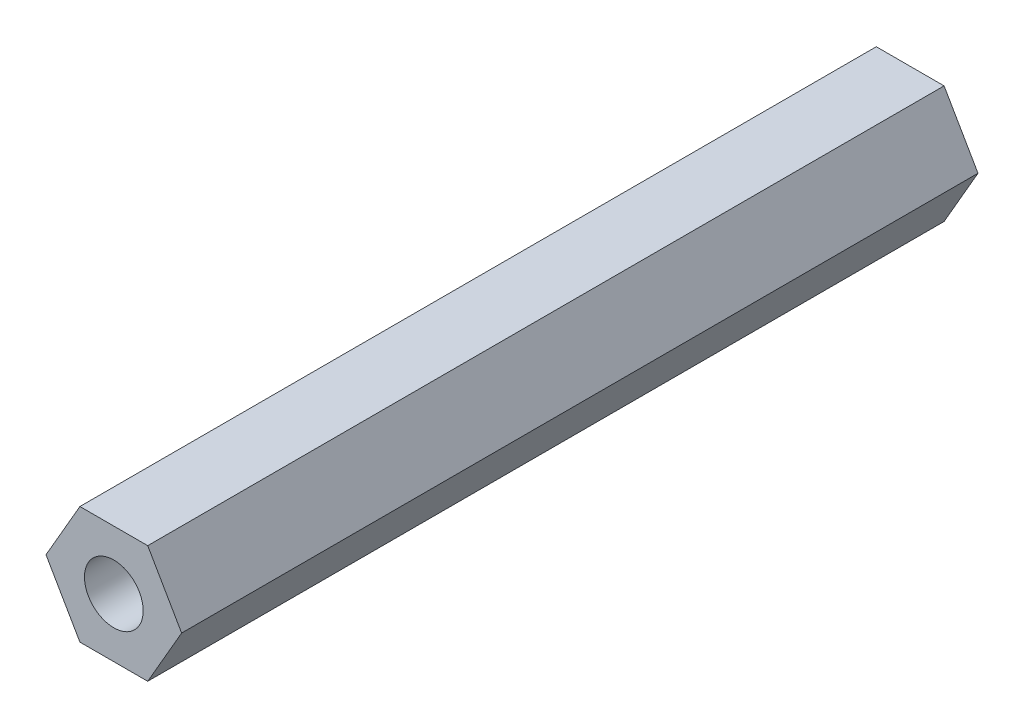
ISO-10303-21;
HEADER;
FILE_DESCRIPTION(('STEP AP214'),'2;1');
FILE_NAME('part.step','',(''),(''),'','','');
FILE_SCHEMA(('AUTOMOTIVE_DESIGN { 1 0 10303 214 1 1 1 1 }'));
ENDSEC;
DATA;
#1=APPLICATION_CONTEXT('core data for automotive mechanical design processes');
#2=APPLICATION_PROTOCOL_DEFINITION('international standard','automotive_design',2000,#1);
#3=PRODUCT_CONTEXT('',#1,'mechanical');
#4=PRODUCT('Part','Part','',(#3));
#5=PRODUCT_RELATED_PRODUCT_CATEGORY('part','',(#4));
#6=PRODUCT_DEFINITION_FORMATION('','',#4);
#7=PRODUCT_DEFINITION_CONTEXT('part definition',#1,'design');
#8=PRODUCT_DEFINITION('design','',#6,#7);
#9=PRODUCT_DEFINITION_SHAPE('','',#8);
#10=(LENGTH_UNIT() NAMED_UNIT(*) SI_UNIT(.MILLI.,.METRE.));
#11=(NAMED_UNIT(*) PLANE_ANGLE_UNIT() SI_UNIT($,.RADIAN.));
#12=(NAMED_UNIT(*) SI_UNIT($,.STERADIAN.) SOLID_ANGLE_UNIT());
#13=UNCERTAINTY_MEASURE_WITH_UNIT(LENGTH_MEASURE(1.E-05),#10,'distance_accuracy_value','');
#14=(GEOMETRIC_REPRESENTATION_CONTEXT(3) GLOBAL_UNCERTAINTY_ASSIGNED_CONTEXT((#13)) GLOBAL_UNIT_ASSIGNED_CONTEXT((#10,
#11,#12)) REPRESENTATION_CONTEXT('',''));
#15=CARTESIAN_POINT('',(0.,0.,0.));
#16=DIRECTION('',(0.,0.,1.));
#17=DIRECTION('',(1.,0.,0.));
#18=AXIS2_PLACEMENT_3D('',#15,#16,#17);
#19=CARTESIAN_POINT('',(0.,0.,43.053));
#20=DIRECTION('',(0.,0.,1.));
#21=DIRECTION('',(1.,0.,0.));
#22=AXIS2_PLACEMENT_3D('',#19,#20,#21);
#23=PLANE('',#22);
#24=DIRECTION('',(-0.5,0.866025403784439,0.));
#25=VECTOR('',#24,1.);
#26=CARTESIAN_POINT('',(7.33234841870825,0.,43.053));
#27=LINE('',#26,#25);
#28=CARTESIAN_POINT('',(7.33234841870825,0.,43.053));
#29=VERTEX_POINT('',#28);
#30=CARTESIAN_POINT('',(3.66617420935413,6.35,43.053));
#31=VERTEX_POINT('',#30);
#32=EDGE_CURVE('E146',#29,#31,#27,.T.);
#33=ORIENTED_EDGE('',*,*,#32,.T.);
#34=DIRECTION('',(-1.,0.,0.));
#35=VECTOR('',#34,1.);
#36=CARTESIAN_POINT('',(3.66617420935413,6.35,43.053));
#37=LINE('',#36,#35);
#38=CARTESIAN_POINT('',(-3.66617420935412,6.35,43.053));
#39=VERTEX_POINT('',#38);
#40=EDGE_CURVE('E94',#31,#39,#37,.T.);
#41=ORIENTED_EDGE('',*,*,#40,.T.);
#42=DIRECTION('',(-0.5,-0.866025403784438,0.));
#43=VECTOR('',#42,1.);
#44=CARTESIAN_POINT('',(-3.66617420935412,6.35,43.053));
#45=LINE('',#44,#43);
#46=CARTESIAN_POINT('',(-7.33234841870825,0.,43.053));
#47=VERTEX_POINT('',#46);
#48=EDGE_CURVE('E107',#39,#47,#45,.T.);
#49=ORIENTED_EDGE('',*,*,#48,.T.);
#50=DIRECTION('',(0.5,-0.866025403784439,0.));
#51=VECTOR('',#50,1.);
#52=CARTESIAN_POINT('',(-7.33234841870825,0.,43.053));
#53=LINE('',#52,#51);
#54=CARTESIAN_POINT('',(-3.66617420935413,-6.35,43.053));
#55=VERTEX_POINT('',#54);
#56=EDGE_CURVE('E101',#47,#55,#53,.T.);
#57=ORIENTED_EDGE('',*,*,#56,.T.);
#58=DIRECTION('',(1.,0.,0.));
#59=VECTOR('',#58,1.);
#60=CARTESIAN_POINT('',(-3.66617420935413,-6.35,43.053));
#61=LINE('',#60,#59);
#62=CARTESIAN_POINT('',(3.66617420935412,-6.35,43.053));
#63=VERTEX_POINT('',#62);
#64=EDGE_CURVE('E105',#55,#63,#61,.T.);
#65=ORIENTED_EDGE('',*,*,#64,.T.);
#66=DIRECTION('',(0.5,0.866025403784438,0.));
#67=VECTOR('',#66,1.);
#68=CARTESIAN_POINT('',(3.66617420935412,-6.35,43.053));
#69=LINE('',#68,#67);
#70=EDGE_CURVE('E57',#63,#29,#69,.T.);
#71=ORIENTED_EDGE('',*,*,#70,.T.);
#72=EDGE_LOOP('',(#33,#41,#49,#57,#65,#71));
#73=FACE_BOUND('',#72,.T.);
#74=CARTESIAN_POINT('',(0.,0.,43.053));
#75=DIRECTION('',(0.,0.,1.));
#76=DIRECTION('',(1.,0.,0.));
#77=AXIS2_PLACEMENT_3D('',#74,#75,#76);
#78=CIRCLE('',#77,3.175);
#79=CARTESIAN_POINT('',(3.175,0.,43.053));
#80=VERTEX_POINT('',#79);
#81=EDGE_CURVE('E134',#80,#80,#78,.T.);
#82=ORIENTED_EDGE('',*,*,#81,.F.);
#83=EDGE_LOOP('',(#82));
#84=FACE_BOUND('',#83,.T.);
#85=ADVANCED_FACE('F39',(#73,#84),#23,.T.);
#86=CARTESIAN_POINT('',(0.,0.,-43.053));
#87=DIRECTION('',(0.,0.,1.));
#88=DIRECTION('',(1.,0.,0.));
#89=AXIS2_PLACEMENT_3D('',#86,#87,#88);
#90=PLANE('',#89);
#91=DIRECTION('',(-0.5,0.866025403784439,0.));
#92=VECTOR('',#91,1.);
#93=CARTESIAN_POINT('',(7.33234841870825,0.,-43.053));
#94=LINE('',#93,#92);
#95=CARTESIAN_POINT('',(7.33234841870825,0.,-43.053));
#96=VERTEX_POINT('',#95);
#97=CARTESIAN_POINT('',(3.66617420935413,6.35,-43.053));
#98=VERTEX_POINT('',#97);
#99=EDGE_CURVE('E129',#96,#98,#94,.T.);
#100=ORIENTED_EDGE('',*,*,#99,.F.);
#101=DIRECTION('',(0.5,0.866025403784438,0.));
#102=VECTOR('',#101,1.);
#103=CARTESIAN_POINT('',(3.66617420935412,-6.35,-43.053));
#104=LINE('',#103,#102);
#105=CARTESIAN_POINT('',(3.66617420935412,-6.35,-43.053));
#106=VERTEX_POINT('',#105);
#107=EDGE_CURVE('E86',#106,#96,#104,.T.);
#108=ORIENTED_EDGE('',*,*,#107,.F.);
#109=DIRECTION('',(1.,0.,0.));
#110=VECTOR('',#109,1.);
#111=CARTESIAN_POINT('',(-3.66617420935413,-6.35,-43.053));
#112=LINE('',#111,#110);
#113=CARTESIAN_POINT('',(-3.66617420935413,-6.35,-43.053));
#114=VERTEX_POINT('',#113);
#115=EDGE_CURVE('E80',#114,#106,#112,.T.);
#116=ORIENTED_EDGE('',*,*,#115,.F.);
#117=DIRECTION('',(0.5,-0.866025403784439,0.));
#118=VECTOR('',#117,1.);
#119=CARTESIAN_POINT('',(-7.33234841870825,0.,-43.053));
#120=LINE('',#119,#118);
#121=CARTESIAN_POINT('',(-7.33234841870825,0.,-43.053));
#122=VERTEX_POINT('',#121);
#123=EDGE_CURVE('E116',#122,#114,#120,.T.);
#124=ORIENTED_EDGE('',*,*,#123,.F.);
#125=DIRECTION('',(-0.5,-0.866025403784438,0.));
#126=VECTOR('',#125,1.);
#127=CARTESIAN_POINT('',(-3.66617420935412,6.35,-43.053));
#128=LINE('',#127,#126);
#129=CARTESIAN_POINT('',(-3.66617420935412,6.35,-43.053));
#130=VERTEX_POINT('',#129);
#131=EDGE_CURVE('E137',#130,#122,#128,.T.);
#132=ORIENTED_EDGE('',*,*,#131,.F.);
#133=DIRECTION('',(-1.,0.,0.));
#134=VECTOR('',#133,1.);
#135=CARTESIAN_POINT('',(3.66617420935413,6.35,-43.053));
#136=LINE('',#135,#134);
#137=EDGE_CURVE('E133',#98,#130,#136,.T.);
#138=ORIENTED_EDGE('',*,*,#137,.F.);
#139=EDGE_LOOP('',(#100,#108,#116,#124,#132,#138));
#140=FACE_BOUND('',#139,.T.);
#141=CARTESIAN_POINT('',(0.,0.,-43.053));
#142=DIRECTION('',(0.,0.,1.));
#143=DIRECTION('',(1.,0.,0.));
#144=AXIS2_PLACEMENT_3D('',#141,#142,#143);
#145=CIRCLE('',#144,3.175);
#146=CARTESIAN_POINT('',(3.175,0.,-43.053));
#147=VERTEX_POINT('',#146);
#148=EDGE_CURVE('E243',#147,#147,#145,.T.);
#149=ORIENTED_EDGE('',*,*,#148,.T.);
#150=EDGE_LOOP('',(#149));
#151=FACE_BOUND('',#150,.T.);
#152=ADVANCED_FACE('F159',(#140,#151),#90,.F.);
#153=CARTESIAN_POINT('',(7.33234841870825,0.,43.053));
#154=DIRECTION('',(-0.866025403784439,-0.5,0.));
#155=DIRECTION('',(0.5,-0.866025403784439,0.));
#156=AXIS2_PLACEMENT_3D('',#153,#154,#155);
#157=PLANE('',#156);
#158=ORIENTED_EDGE('',*,*,#99,.T.);
#159=DIRECTION('',(0.,0.,-1.));
#160=VECTOR('',#159,1.);
#161=CARTESIAN_POINT('',(3.66617420935413,6.35,43.053));
#162=LINE('',#161,#160);
#163=EDGE_CURVE('E11',#31,#98,#162,.T.);
#164=ORIENTED_EDGE('',*,*,#163,.F.);
#165=ORIENTED_EDGE('',*,*,#32,.F.);
#166=DIRECTION('',(0.,0.,-1.));
#167=VECTOR('',#166,1.);
#168=CARTESIAN_POINT('',(7.33234841870825,0.,43.053));
#169=LINE('',#168,#167);
#170=EDGE_CURVE('E125',#29,#96,#169,.T.);
#171=ORIENTED_EDGE('',*,*,#170,.T.);
#172=EDGE_LOOP('',(#158,#164,#165,#171));
#173=FACE_BOUND('',#172,.T.);
#174=ADVANCED_FACE('F41',(#173),#157,.F.);
#175=CARTESIAN_POINT('',(3.66617420935413,6.35,43.053));
#176=DIRECTION('',(0.,-1.,0.));
#177=DIRECTION('',(1.,0.,0.));
#178=AXIS2_PLACEMENT_3D('',#175,#176,#177);
#179=PLANE('',#178);
#180=ORIENTED_EDGE('',*,*,#137,.T.);
#181=DIRECTION('',(0.,0.,-1.));
#182=VECTOR('',#181,1.);
#183=CARTESIAN_POINT('',(-3.66617420935412,6.35,43.053));
#184=LINE('',#183,#182);
#185=EDGE_CURVE('E49',#39,#130,#184,.T.);
#186=ORIENTED_EDGE('',*,*,#185,.F.);
#187=ORIENTED_EDGE('',*,*,#40,.F.);
#188=ORIENTED_EDGE('',*,*,#163,.T.);
#189=EDGE_LOOP('',(#180,#186,#187,#188));
#190=FACE_BOUND('',#189,.T.);
#191=ADVANCED_FACE('F184',(#190),#179,.F.);
#192=CARTESIAN_POINT('',(-3.66617420935412,6.35,43.053));
#193=DIRECTION('',(0.866025403784439,-0.5,0.));
#194=DIRECTION('',(0.5,0.866025403784439,0.));
#195=AXIS2_PLACEMENT_3D('',#192,#193,#194);
#196=PLANE('',#195);
#197=ORIENTED_EDGE('',*,*,#131,.T.);
#198=DIRECTION('',(0.,0.,-1.));
#199=VECTOR('',#198,1.);
#200=CARTESIAN_POINT('',(-7.33234841870825,0.,43.053));
#201=LINE('',#200,#199);
#202=EDGE_CURVE('E118',#47,#122,#201,.T.);
#203=ORIENTED_EDGE('',*,*,#202,.F.);
#204=ORIENTED_EDGE('',*,*,#48,.F.);
#205=ORIENTED_EDGE('',*,*,#185,.T.);
#206=EDGE_LOOP('',(#197,#203,#204,#205));
#207=FACE_BOUND('',#206,.T.);
#208=ADVANCED_FACE('F156',(#207),#196,.F.);
#209=CARTESIAN_POINT('',(-7.33234841870825,0.,43.053));
#210=DIRECTION('',(0.866025403784439,0.5,0.));
#211=DIRECTION('',(-0.5,0.866025403784439,0.));
#212=AXIS2_PLACEMENT_3D('',#209,#210,#211);
#213=PLANE('',#212);
#214=ORIENTED_EDGE('',*,*,#123,.T.);
#215=DIRECTION('',(0.,0.,-1.));
#216=VECTOR('',#215,1.);
#217=CARTESIAN_POINT('',(-3.66617420935413,-6.35,43.053));
#218=LINE('',#217,#216);
#219=EDGE_CURVE('E113',#55,#114,#218,.T.);
#220=ORIENTED_EDGE('',*,*,#219,.F.);
#221=ORIENTED_EDGE('',*,*,#56,.F.);
#222=ORIENTED_EDGE('',*,*,#202,.T.);
#223=EDGE_LOOP('',(#214,#220,#221,#222));
#224=FACE_BOUND('',#223,.T.);
#225=ADVANCED_FACE('F114',(#224),#213,.F.);
#226=CARTESIAN_POINT('',(-3.66617420935413,-6.35,43.053));
#227=DIRECTION('',(0.,1.,0.));
#228=DIRECTION('',(-1.,0.,0.));
#229=AXIS2_PLACEMENT_3D('',#226,#227,#228);
#230=PLANE('',#229);
#231=ORIENTED_EDGE('',*,*,#115,.T.);
#232=DIRECTION('',(0.,0.,-1.));
#233=VECTOR('',#232,1.);
#234=CARTESIAN_POINT('',(3.66617420935412,-6.35,43.053));
#235=LINE('',#234,#233);
#236=EDGE_CURVE('E119',#63,#106,#235,.T.);
#237=ORIENTED_EDGE('',*,*,#236,.F.);
#238=ORIENTED_EDGE('',*,*,#64,.F.);
#239=ORIENTED_EDGE('',*,*,#219,.T.);
#240=EDGE_LOOP('',(#231,#237,#238,#239));
#241=FACE_BOUND('',#240,.T.);
#242=ADVANCED_FACE('F121',(#241),#230,.F.);
#243=CARTESIAN_POINT('',(3.66617420935412,-6.35,43.053));
#244=DIRECTION('',(-0.866025403784438,0.5,0.));
#245=DIRECTION('',(-0.5,-0.866025403784438,0.));
#246=AXIS2_PLACEMENT_3D('',#243,#244,#245);
#247=PLANE('',#246);
#248=ORIENTED_EDGE('',*,*,#107,.T.);
#249=ORIENTED_EDGE('',*,*,#170,.F.);
#250=ORIENTED_EDGE('',*,*,#70,.F.);
#251=ORIENTED_EDGE('',*,*,#236,.T.);
#252=EDGE_LOOP('',(#248,#249,#250,#251));
#253=FACE_BOUND('',#252,.T.);
#254=ADVANCED_FACE('F164',(#253),#247,.F.);
#255=CARTESIAN_POINT('',(0.,0.,43.053));
#256=DIRECTION('',(0.,0.,-1.));
#257=DIRECTION('',(-1.,0.,0.));
#258=AXIS2_PLACEMENT_3D('',#255,#256,#257);
#259=CYLINDRICAL_SURFACE('',#258,3.175);
#260=ORIENTED_EDGE('',*,*,#81,.T.);
#261=EDGE_LOOP('',(#260));
#262=FACE_BOUND('',#261,.T.);
#263=ORIENTED_EDGE('',*,*,#148,.F.);
#264=EDGE_LOOP('',(#263));
#265=FACE_BOUND('',#264,.T.);
#266=ADVANCED_FACE('F166',(#262,#265),#259,.F.);
#267=CLOSED_SHELL('',(#85,#152,#174,#191,#208,#225,#242,#254,#266));
#268=MANIFOLD_SOLID_BREP('B2',#267);
#269=ADVANCED_BREP_SHAPE_REPRESENTATION('',(#18,#268),#14);
#270=SHAPE_DEFINITION_REPRESENTATION(#9,#269);
ENDSEC;
END-ISO-10303-21;
